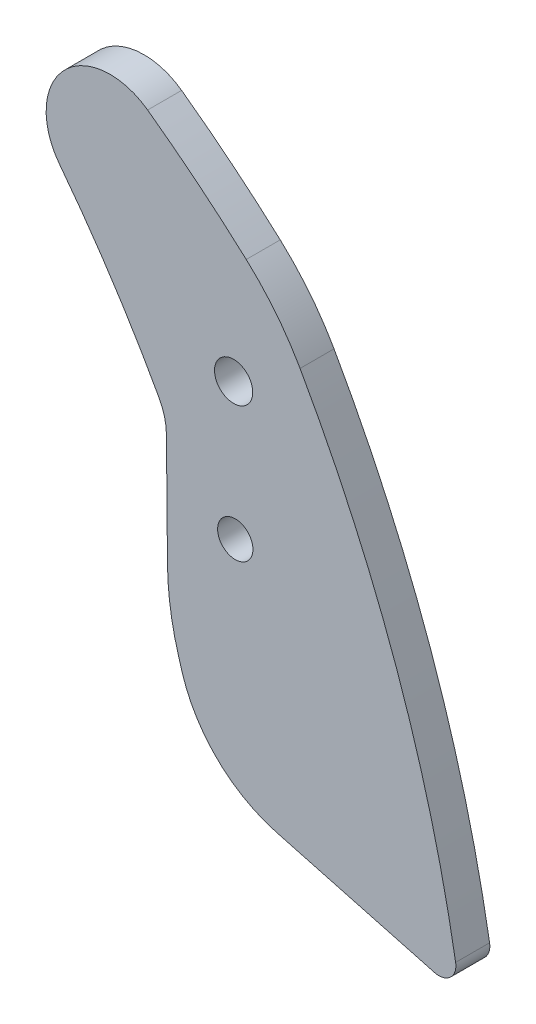
ISO-10303-21;
HEADER;
FILE_DESCRIPTION(('STEP AP214'),'2;1');
FILE_NAME('part.step','',(''),(''),'','','');
FILE_SCHEMA(('AUTOMOTIVE_DESIGN { 1 0 10303 214 1 1 1 1 }'));
ENDSEC;
DATA;
#1=APPLICATION_CONTEXT('core data for automotive mechanical design processes');
#2=APPLICATION_PROTOCOL_DEFINITION('international standard','automotive_design',2000,#1);
#3=PRODUCT_CONTEXT('',#1,'mechanical');
#4=PRODUCT('Part','Part','',(#3));
#5=PRODUCT_RELATED_PRODUCT_CATEGORY('part','',(#4));
#6=PRODUCT_DEFINITION_FORMATION('','',#4);
#7=PRODUCT_DEFINITION_CONTEXT('part definition',#1,'design');
#8=PRODUCT_DEFINITION('design','',#6,#7);
#9=PRODUCT_DEFINITION_SHAPE('','',#8);
#10=(LENGTH_UNIT() NAMED_UNIT(*) SI_UNIT(.MILLI.,.METRE.));
#11=(NAMED_UNIT(*) PLANE_ANGLE_UNIT() SI_UNIT($,.RADIAN.));
#12=(NAMED_UNIT(*) SI_UNIT($,.STERADIAN.) SOLID_ANGLE_UNIT());
#13=UNCERTAINTY_MEASURE_WITH_UNIT(LENGTH_MEASURE(1.E-05),#10,'distance_accuracy_value','');
#14=(GEOMETRIC_REPRESENTATION_CONTEXT(3) GLOBAL_UNCERTAINTY_ASSIGNED_CONTEXT((#13)) GLOBAL_UNIT_ASSIGNED_CONTEXT((#10,
#11,#12)) REPRESENTATION_CONTEXT('',''));
#15=CARTESIAN_POINT('',(0.,0.,0.));
#16=DIRECTION('',(0.,0.,1.));
#17=DIRECTION('',(1.,0.,0.));
#18=AXIS2_PLACEMENT_3D('',#15,#16,#17);
#19=CARTESIAN_POINT('',(-113.879070235342,148.704037871427,6.35));
#20=DIRECTION('',(0.,0.,-1.));
#21=DIRECTION('',(-1.,0.,0.));
#22=AXIS2_PLACEMENT_3D('',#19,#20,#21);
#23=CYLINDRICAL_SURFACE('',#22,11.9633626690362);
#24=CARTESIAN_POINT('',(-113.879070235342,148.704037871427,0.));
#25=DIRECTION('',(0.,0.,1.));
#26=DIRECTION('',(1.,0.,0.));
#27=AXIS2_PLACEMENT_3D('',#24,#25,#26);
#28=CIRCLE('',#27,11.9633626690362);
#29=CARTESIAN_POINT('',(-123.364773653101,141.414080599866,0.));
#30=VERTEX_POINT('',#29);
#31=CARTESIAN_POINT('',(-106.865340620496,158.395768534252,0.));
#32=VERTEX_POINT('',#31);
#33=EDGE_CURVE('E143',#30,#32,#28,.F.);
#34=ORIENTED_EDGE('',*,*,#33,.F.);
#35=DIRECTION('',(0.,0.,-1.));
#36=VECTOR('',#35,1.);
#37=CARTESIAN_POINT('',(-123.364773653101,141.414080599866,6.35));
#38=LINE('',#37,#36);
#39=CARTESIAN_POINT('',(-123.364773653101,141.414080599866,6.35));
#40=VERTEX_POINT('',#39);
#41=EDGE_CURVE('E131',#40,#30,#38,.T.);
#42=ORIENTED_EDGE('',*,*,#41,.F.);
#43=CARTESIAN_POINT('',(-113.879070235342,148.704037871427,6.35));
#44=DIRECTION('',(0.,0.,1.));
#45=DIRECTION('',(1.,0.,0.));
#46=AXIS2_PLACEMENT_3D('',#43,#44,#45);
#47=CIRCLE('',#46,11.9633626690362);
#48=CARTESIAN_POINT('',(-106.865340620496,158.395768534252,6.35));
#49=VERTEX_POINT('',#48);
#50=EDGE_CURVE('E138',#40,#49,#47,.F.);
#51=ORIENTED_EDGE('',*,*,#50,.T.);
#52=DIRECTION('',(0.,0.,-1.));
#53=VECTOR('',#52,1.);
#54=CARTESIAN_POINT('',(-106.865340620496,158.395768534252,6.35));
#55=LINE('',#54,#53);
#56=EDGE_CURVE('E176',#49,#32,#55,.T.);
#57=ORIENTED_EDGE('',*,*,#56,.T.);
#58=EDGE_LOOP('',(#34,#42,#51,#57));
#59=FACE_BOUND('',#58,.T.);
#60=ADVANCED_FACE('F36',(#59),#23,.T.);
#61=CARTESIAN_POINT('',(-299.585928433731,5.98451548285919,6.35));
#62=DIRECTION('',(0.,0.,-1.));
#63=DIRECTION('',(-1.,0.,0.));
#64=AXIS2_PLACEMENT_3D('',#61,#62,#63);
#65=CYLINDRICAL_SURFACE('',#64,222.25);
#66=CARTESIAN_POINT('',(-299.585928433731,5.98451548285919,0.));
#67=DIRECTION('',(0.,0.,1.));
#68=DIRECTION('',(1.,0.,0.));
#69=AXIS2_PLACEMENT_3D('',#66,#67,#68);
#70=CIRCLE('',#69,222.25);
#71=CARTESIAN_POINT('',(-104.721441138378,112.862455634788,0.));
#72=VERTEX_POINT('',#71);
#73=EDGE_CURVE('E178',#72,#30,#70,.T.);
#74=ORIENTED_EDGE('',*,*,#73,.F.);
#75=DIRECTION('',(0.,0.,-1.));
#76=VECTOR('',#75,1.);
#77=CARTESIAN_POINT('',(-104.721441138378,112.862455634788,6.35));
#78=LINE('',#77,#76);
#79=CARTESIAN_POINT('',(-104.721441138378,112.862455634788,6.35));
#80=VERTEX_POINT('',#79);
#81=EDGE_CURVE('E134',#72,#80,#78,.F.);
#82=ORIENTED_EDGE('',*,*,#81,.T.);
#83=CARTESIAN_POINT('',(-299.585928433731,5.98451548285919,6.35));
#84=DIRECTION('',(0.,0.,1.));
#85=DIRECTION('',(1.,0.,0.));
#86=AXIS2_PLACEMENT_3D('',#83,#84,#85);
#87=CIRCLE('',#86,222.25);
#88=EDGE_CURVE('E127',#80,#40,#87,.T.);
#89=ORIENTED_EDGE('',*,*,#88,.T.);
#90=ORIENTED_EDGE('',*,*,#41,.T.);
#91=EDGE_LOOP('',(#74,#82,#89,#90));
#92=FACE_BOUND('',#91,.T.);
#93=ADVANCED_FACE('F130',(#92),#65,.F.);
#94=CARTESIAN_POINT('',(-102.331128611491,-0.962687486218128,6.35));
#95=DIRECTION('',(0.999955751729183,0.00940715598492309,0.));
#96=DIRECTION('',(-0.00940715598492309,0.999955751729183,0.));
#97=AXIS2_PLACEMENT_3D('',#94,#95,#96);
#98=PLANE('',#97);
#99=DIRECTION('',(0.00940715598492309,-0.999955751729183,0.));
#100=VECTOR('',#99,1.);
#101=CARTESIAN_POINT('',(-102.331128611491,-0.962687486218128,6.35));
#102=LINE('',#101,#100);
#103=CARTESIAN_POINT('',(-103.352657212055,107.623095648074,6.35));
#104=VERTEX_POINT('',#103);
#105=CARTESIAN_POINT('',(-103.15638986928,86.7603972301212,6.35));
#106=VERTEX_POINT('',#105);
#107=EDGE_CURVE('E137',#104,#106,#102,.T.);
#108=ORIENTED_EDGE('',*,*,#107,.F.);
#109=DIRECTION('',(0.,0.,-1.));
#110=VECTOR('',#109,1.);
#111=CARTESIAN_POINT('',(-103.352657212055,107.623095648074,6.35));
#112=LINE('',#111,#110);
#113=CARTESIAN_POINT('',(-103.352657212055,107.623095648074,0.));
#114=VERTEX_POINT('',#113);
#115=EDGE_CURVE('E144',#104,#114,#112,.T.);
#116=ORIENTED_EDGE('',*,*,#115,.T.);
#117=DIRECTION('',(0.00940715598492309,-0.999955751729183,0.));
#118=VECTOR('',#117,1.);
#119=CARTESIAN_POINT('',(-102.331128611491,-0.962687486218128,0.));
#120=LINE('',#119,#118);
#121=CARTESIAN_POINT('',(-103.15638986928,86.7603972301212,0.));
#122=VERTEX_POINT('',#121);
#123=EDGE_CURVE('E180',#114,#122,#120,.T.);
#124=ORIENTED_EDGE('',*,*,#123,.T.);
#125=DIRECTION('',(0.,0.,-1.));
#126=VECTOR('',#125,1.);
#127=CARTESIAN_POINT('',(-103.15638986928,86.7603972301212,6.35));
#128=LINE('',#127,#126);
#129=EDGE_CURVE('E145',#106,#122,#128,.T.);
#130=ORIENTED_EDGE('',*,*,#129,.F.);
#131=EDGE_LOOP('',(#108,#116,#124,#130));
#132=FACE_BOUND('',#131,.T.);
#133=ADVANCED_FACE('F240',(#132),#98,.F.);
#134=CARTESIAN_POINT('',(-52.358637681438,87.2382807541552,6.35));
#135=DIRECTION('',(0.,0.,-1.));
#136=DIRECTION('',(-1.,0.,0.));
#137=AXIS2_PLACEMENT_3D('',#134,#135,#136);
#138=CYLINDRICAL_SURFACE('',#137,50.7999999999998);
#139=CARTESIAN_POINT('',(-52.358637681438,87.2382807541552,0.));
#140=DIRECTION('',(0.,0.,1.));
#141=DIRECTION('',(1.,0.,0.));
#142=AXIS2_PLACEMENT_3D('',#139,#140,#141);
#143=CIRCLE('',#142,50.7999999999998);
#144=CARTESIAN_POINT('',(-101.08553478829,72.8741066275903,0.));
#145=VERTEX_POINT('',#144);
#146=EDGE_CURVE('E182',#122,#145,#143,.T.);
#147=ORIENTED_EDGE('',*,*,#146,.T.);
#148=DIRECTION('',(0.,0.,-1.));
#149=VECTOR('',#148,1.);
#150=CARTESIAN_POINT('',(-101.08553478829,72.8741066275903,6.35));
#151=LINE('',#150,#149);
#152=CARTESIAN_POINT('',(-101.08553478829,72.8741066275903,6.35));
#153=VERTEX_POINT('',#152);
#154=EDGE_CURVE('E205',#153,#145,#151,.T.);
#155=ORIENTED_EDGE('',*,*,#154,.F.);
#156=CARTESIAN_POINT('',(-52.358637681438,87.2382807541552,6.35));
#157=DIRECTION('',(0.,0.,1.));
#158=DIRECTION('',(1.,0.,0.));
#159=AXIS2_PLACEMENT_3D('',#156,#157,#158);
#160=CIRCLE('',#159,50.7999999999998);
#161=EDGE_CURVE('E159',#106,#153,#160,.T.);
#162=ORIENTED_EDGE('',*,*,#161,.F.);
#163=ORIENTED_EDGE('',*,*,#129,.T.);
#164=EDGE_LOOP('',(#147,#155,#162,#163));
#165=FACE_BOUND('',#164,.T.);
#166=ADVANCED_FACE('F244',(#165),#138,.T.);
#167=CARTESIAN_POINT('',(-73.2385311304858,-21.5899446998464,6.35));
#168=DIRECTION('',(0.959190887930161,0.28275933320007,0.));
#169=DIRECTION('',(-0.28275933320007,0.959190887930162,0.));
#170=AXIS2_PLACEMENT_3D('',#167,#168,#169);
#171=PLANE('',#170);
#172=DIRECTION('',(0.28275933320007,-0.959190887930161,0.));
#173=VECTOR('',#172,1.);
#174=CARTESIAN_POINT('',(-73.2385311304858,-21.5899446998464,0.));
#175=LINE('',#174,#173);
#176=CARTESIAN_POINT('',(-100.480479070447,70.8216052134851,0.));
#177=VERTEX_POINT('',#176);
#178=EDGE_CURVE('E184',#145,#177,#175,.T.);
#179=ORIENTED_EDGE('',*,*,#178,.T.);
#180=DIRECTION('',(0.,0.,-1.));
#181=VECTOR('',#180,1.);
#182=CARTESIAN_POINT('',(-100.480479070447,70.8216052134851,6.35));
#183=LINE('',#182,#181);
#184=CARTESIAN_POINT('',(-100.480479070447,70.8216052134851,6.35));
#185=VERTEX_POINT('',#184);
#186=EDGE_CURVE('E59',#177,#185,#183,.F.);
#187=ORIENTED_EDGE('',*,*,#186,.T.);
#188=DIRECTION('',(0.28275933320007,-0.959190887930161,0.));
#189=VECTOR('',#188,1.);
#190=CARTESIAN_POINT('',(-73.2385311304858,-21.5899446998464,6.35));
#191=LINE('',#190,#189);
#192=EDGE_CURVE('E161',#153,#185,#191,.T.);
#193=ORIENTED_EDGE('',*,*,#192,.F.);
#194=ORIENTED_EDGE('',*,*,#154,.T.);
#195=EDGE_LOOP('',(#179,#187,#193,#194));
#196=FACE_BOUND('',#195,.T.);
#197=ADVANCED_FACE('F343',(#196),#171,.F.);
#198=CARTESIAN_POINT('',(7.82804510926493,29.2146620717186,6.35));
#199=DIRECTION('',(0.258819045102514,0.96592582628907,0.));
#200=DIRECTION('',(-0.96592582628907,0.258819045102514,0.));
#201=AXIS2_PLACEMENT_3D('',#198,#199,#200);
#202=PLANE('',#201);
#203=DIRECTION('',(0.96592582628907,-0.258819045102514,0.));
#204=VECTOR('',#203,1.);
#205=CARTESIAN_POINT('',(7.82804510926493,29.2146620717186,6.35));
#206=LINE('',#205,#204);
#207=CARTESIAN_POINT('',(-82.6910342626248,53.4691762890245,6.35));
#208=VERTEX_POINT('',#207);
#209=CARTESIAN_POINT('',(-53.236955372904,45.5769796367214,6.35));
#210=VERTEX_POINT('',#209);
#211=EDGE_CURVE('E163',#208,#210,#206,.T.);
#212=ORIENTED_EDGE('',*,*,#211,.F.);
#213=DIRECTION('',(0.,0.,-1.));
#214=VECTOR('',#213,1.);
#215=CARTESIAN_POINT('',(-82.6910342626248,53.4691762890245,6.35));
#216=LINE('',#215,#214);
#217=CARTESIAN_POINT('',(-82.6910342626248,53.4691762890245,0.));
#218=VERTEX_POINT('',#217);
#219=EDGE_CURVE('E215',#208,#218,#216,.T.);
#220=ORIENTED_EDGE('',*,*,#219,.T.);
#221=DIRECTION('',(0.96592582628907,-0.258819045102514,0.));
#222=VECTOR('',#221,1.);
#223=CARTESIAN_POINT('',(7.82804510926493,29.2146620717186,0.));
#224=LINE('',#223,#222);
#225=CARTESIAN_POINT('',(-53.236955372904,45.5769796367214,0.));
#226=VERTEX_POINT('',#225);
#227=EDGE_CURVE('E186',#218,#226,#224,.T.);
#228=ORIENTED_EDGE('',*,*,#227,.T.);
#229=DIRECTION('',(0.,0.,-1.));
#230=VECTOR('',#229,1.);
#231=CARTESIAN_POINT('',(-53.236955372904,45.5769796367214,6.35));
#232=LINE('',#231,#230);
#233=EDGE_CURVE('E213',#226,#210,#232,.F.);
#234=ORIENTED_EDGE('',*,*,#233,.T.);
#235=EDGE_LOOP('',(#212,#220,#228,#234));
#236=FACE_BOUND('',#235,.T.);
#237=ADVANCED_FACE('F251',(#236),#202,.F.);
#238=CARTESIAN_POINT('',(-299.585928433731,5.98451548285919,6.35));
#239=DIRECTION('',(0.,0.,-1.));
#240=DIRECTION('',(-1.,0.,0.));
#241=AXIS2_PLACEMENT_3D('',#238,#239,#240);
#242=CYLINDRICAL_SURFACE('',#241,254.);
#243=CARTESIAN_POINT('',(-299.585928433731,5.98451548285919,6.35));
#244=DIRECTION('',(0.,0.,1.));
#245=DIRECTION('',(1.,0.,0.));
#246=AXIS2_PLACEMENT_3D('',#243,#244,#245);
#247=CIRCLE('',#246,254.);
#248=CARTESIAN_POINT('',(-49.2864615688931,49.1837850042061,6.35));
#249=VERTEX_POINT('',#248);
#250=CARTESIAN_POINT('',(-78.3700385424587,130.802503207436,6.35));
#251=VERTEX_POINT('',#250);
#252=EDGE_CURVE('E165',#249,#251,#247,.T.);
#253=ORIENTED_EDGE('',*,*,#252,.F.);
#254=DIRECTION('',(0.,0.,-1.));
#255=VECTOR('',#254,1.);
#256=CARTESIAN_POINT('',(-49.2864615688931,49.1837850042061,6.35));
#257=LINE('',#256,#255);
#258=CARTESIAN_POINT('',(-49.2864615688931,49.1837850042061,0.));
#259=VERTEX_POINT('',#258);
#260=EDGE_CURVE('E226',#249,#259,#257,.T.);
#261=ORIENTED_EDGE('',*,*,#260,.T.);
#262=CARTESIAN_POINT('',(-299.585928433731,5.98451548285919,0.));
#263=DIRECTION('',(0.,0.,1.));
#264=DIRECTION('',(1.,0.,0.));
#265=AXIS2_PLACEMENT_3D('',#262,#263,#264);
#266=CIRCLE('',#265,254.);
#267=CARTESIAN_POINT('',(-78.3700385424587,130.802503207436,0.));
#268=VERTEX_POINT('',#267);
#269=EDGE_CURVE('E189',#259,#268,#266,.T.);
#270=ORIENTED_EDGE('',*,*,#269,.T.);
#271=DIRECTION('',(0.,0.,-1.));
#272=VECTOR('',#271,1.);
#273=CARTESIAN_POINT('',(-78.3700385424587,130.802503207436,6.35));
#274=LINE('',#273,#272);
#275=EDGE_CURVE('E202',#251,#268,#274,.T.);
#276=ORIENTED_EDGE('',*,*,#275,.F.);
#277=EDGE_LOOP('',(#253,#261,#270,#276));
#278=FACE_BOUND('',#277,.T.);
#279=ADVANCED_FACE('F259',(#278),#242,.T.);
#280=CARTESIAN_POINT('',(-122.613216520713,105.83890566252,6.35));
#281=DIRECTION('',(0.,0.,-1.));
#282=DIRECTION('',(-1.,0.,0.));
#283=AXIS2_PLACEMENT_3D('',#280,#281,#282);
#284=CYLINDRICAL_SURFACE('',#283,50.8);
#285=CARTESIAN_POINT('',(-122.613216520713,105.83890566252,0.));
#286=DIRECTION('',(0.,0.,1.));
#287=DIRECTION('',(1.,0.,0.));
#288=AXIS2_PLACEMENT_3D('',#285,#286,#287);
#289=CIRCLE('',#288,50.8);
#290=CARTESIAN_POINT('',(-88.4278492038008,143.415502919427,0.));
#291=VERTEX_POINT('',#290);
#292=EDGE_CURVE('E191',#268,#291,#289,.T.);
#293=ORIENTED_EDGE('',*,*,#292,.T.);
#294=DIRECTION('',(0.,0.,-1.));
#295=VECTOR('',#294,1.);
#296=CARTESIAN_POINT('',(-88.4278492038008,143.415502919427,6.35));
#297=LINE('',#296,#295);
#298=CARTESIAN_POINT('',(-88.4278492038008,143.415502919427,6.35));
#299=VERTEX_POINT('',#298);
#300=EDGE_CURVE('E199',#299,#291,#297,.T.);
#301=ORIENTED_EDGE('',*,*,#300,.F.);
#302=CARTESIAN_POINT('',(-122.613216520713,105.83890566252,6.35));
#303=DIRECTION('',(0.,0.,1.));
#304=DIRECTION('',(1.,0.,0.));
#305=AXIS2_PLACEMENT_3D('',#302,#303,#304);
#306=CIRCLE('',#305,50.8);
#307=EDGE_CURVE('E167',#251,#299,#306,.T.);
#308=ORIENTED_EDGE('',*,*,#307,.F.);
#309=ORIENTED_EDGE('',*,*,#275,.T.);
#310=EDGE_LOOP('',(#293,#301,#308,#309));
#311=FACE_BOUND('',#310,.T.);
#312=ADVANCED_FACE('F264',(#311),#284,.T.);
#313=CARTESIAN_POINT('',(-90.792034131268,122.498229566222,6.35));
#314=DIRECTION('',(0.,0.,-1.));
#315=DIRECTION('',(-1.,0.,0.));
#316=AXIS2_PLACEMENT_3D('',#313,#314,#315);
#317=CYLINDRICAL_SURFACE('',#316,3.57187500000001);
#318=CARTESIAN_POINT('',(-90.792034131268,122.498229566222,6.35));
#319=DIRECTION('',(0.,0.,1.));
#320=DIRECTION('',(1.,0.,0.));
#321=AXIS2_PLACEMENT_3D('',#318,#319,#320);
#322=CIRCLE('',#321,3.57187500000001);
#323=CARTESIAN_POINT('',(-87.220159131268,122.498229566222,6.35));
#324=VERTEX_POINT('',#323);
#325=EDGE_CURVE('E170',#324,#324,#322,.T.);
#326=ORIENTED_EDGE('',*,*,#325,.T.);
#327=EDGE_LOOP('',(#326));
#328=FACE_BOUND('',#327,.T.);
#329=CARTESIAN_POINT('',(-90.792034131268,122.498229566222,0.));
#330=DIRECTION('',(0.,0.,1.));
#331=DIRECTION('',(1.,0.,0.));
#332=AXIS2_PLACEMENT_3D('',#329,#330,#331);
#333=CIRCLE('',#332,3.57187500000001);
#334=CARTESIAN_POINT('',(-87.220159131268,122.498229566222,0.));
#335=VERTEX_POINT('',#334);
#336=EDGE_CURVE('E155',#335,#335,#333,.T.);
#337=ORIENTED_EDGE('',*,*,#336,.F.);
#338=EDGE_LOOP('',(#337));
#339=FACE_BOUND('',#338,.T.);
#340=ADVANCED_FACE('F270',(#328,#339),#317,.F.);
#341=CARTESIAN_POINT('',(-231.579074843371,-13.9364980938701,6.35));
#342=DIRECTION('',(0.,0.,-1.));
#343=DIRECTION('',(-1.,0.,0.));
#344=AXIS2_PLACEMENT_3D('',#341,#342,#343);
#345=CYLINDRICAL_SURFACE('',#344,212.725);
#346=CARTESIAN_POINT('',(-231.579074843371,-13.9364980938701,0.));
#347=DIRECTION('',(0.,0.,1.));
#348=DIRECTION('',(1.,0.,0.));
#349=AXIS2_PLACEMENT_3D('',#346,#347,#348);
#350=CIRCLE('',#349,212.725);
#351=EDGE_CURVE('E193',#291,#32,#350,.T.);
#352=ORIENTED_EDGE('',*,*,#351,.T.);
#353=ORIENTED_EDGE('',*,*,#56,.F.);
#354=CARTESIAN_POINT('',(-231.579074843371,-13.9364980938701,6.35));
#355=DIRECTION('',(0.,0.,1.));
#356=DIRECTION('',(1.,0.,0.));
#357=AXIS2_PLACEMENT_3D('',#354,#355,#356);
#358=CIRCLE('',#357,212.725);
#359=EDGE_CURVE('E150',#299,#49,#358,.T.);
#360=ORIENTED_EDGE('',*,*,#359,.F.);
#361=ORIENTED_EDGE('',*,*,#300,.T.);
#362=EDGE_LOOP('',(#352,#353,#360,#361));
#363=FACE_BOUND('',#362,.T.);
#364=ADVANCED_FACE('F267',(#363),#345,.T.);
#365=CARTESIAN_POINT('',(-90.4829115348646,97.1001106748474,6.35));
#366=DIRECTION('',(0.,0.,-1.));
#367=DIRECTION('',(-1.,0.,0.));
#368=AXIS2_PLACEMENT_3D('',#365,#366,#367);
#369=CYLINDRICAL_SURFACE('',#368,3.302);
#370=CARTESIAN_POINT('',(-90.4829115348646,97.1001106748474,6.35));
#371=DIRECTION('',(0.,0.,1.));
#372=DIRECTION('',(1.,0.,0.));
#373=AXIS2_PLACEMENT_3D('',#370,#371,#372);
#374=CIRCLE('',#373,3.302);
#375=CARTESIAN_POINT('',(-87.1809115348646,97.1001106748474,6.35));
#376=VERTEX_POINT('',#375);
#377=EDGE_CURVE('E173',#376,#376,#374,.T.);
#378=ORIENTED_EDGE('',*,*,#377,.T.);
#379=EDGE_LOOP('',(#378));
#380=FACE_BOUND('',#379,.T.);
#381=CARTESIAN_POINT('',(-90.4829115348646,97.1001106748474,0.));
#382=DIRECTION('',(0.,0.,1.));
#383=DIRECTION('',(1.,0.,0.));
#384=AXIS2_PLACEMENT_3D('',#381,#382,#383);
#385=CIRCLE('',#384,3.302);
#386=CARTESIAN_POINT('',(-87.1809115348646,97.1001106748474,0.));
#387=VERTEX_POINT('',#386);
#388=EDGE_CURVE('E152',#387,#387,#385,.T.);
#389=ORIENTED_EDGE('',*,*,#388,.F.);
#390=EDGE_LOOP('',(#389));
#391=FACE_BOUND('',#390,.T.);
#392=ADVANCED_FACE('F269',(#380,#391),#369,.F.);
#393=CARTESIAN_POINT('',(0.,0.,6.35));
#394=DIRECTION('',(0.,0.,1.));
#395=DIRECTION('',(1.,0.,0.));
#396=AXIS2_PLACEMENT_3D('',#393,#394,#395);
#397=PLANE('',#396);
#398=ORIENTED_EDGE('',*,*,#192,.T.);
#399=CARTESIAN_POINT('',(-76.117030517021,78.0036922767669,6.35));
#400=DIRECTION('',(0.,0.,1.));
#401=DIRECTION('',(1.,0.,0.));
#402=AXIS2_PLACEMENT_3D('',#399,#400,#401);
#403=CIRCLE('',#402,25.4);
#404=EDGE_CURVE('E224',#185,#208,#403,.T.);
#405=ORIENTED_EDGE('',*,*,#404,.T.);
#406=ORIENTED_EDGE('',*,*,#211,.T.);
#407=CARTESIAN_POINT('',(-52.4152049047036,48.6437941351892,6.35));
#408=DIRECTION('',(0.,0.,1.));
#409=DIRECTION('',(1.,0.,0.));
#410=AXIS2_PLACEMENT_3D('',#407,#408,#409);
#411=CIRCLE('',#410,3.175);
#412=EDGE_CURVE('E51',#210,#249,#411,.T.);
#413=ORIENTED_EDGE('',*,*,#412,.T.);
#414=ORIENTED_EDGE('',*,*,#252,.T.);
#415=ORIENTED_EDGE('',*,*,#307,.T.);
#416=ORIENTED_EDGE('',*,*,#359,.T.);
#417=ORIENTED_EDGE('',*,*,#50,.F.);
#418=ORIENTED_EDGE('',*,*,#88,.F.);
#419=CARTESIAN_POINT('',(-114.464665503146,107.518558627191,6.35));
#420=DIRECTION('',(0.,0.,1.));
#421=DIRECTION('',(1.,0.,0.));
#422=AXIS2_PLACEMENT_3D('',#419,#420,#421);
#423=CIRCLE('',#422,11.1125);
#424=EDGE_CURVE('E12',#80,#104,#423,.F.);
#425=ORIENTED_EDGE('',*,*,#424,.T.);
#426=ORIENTED_EDGE('',*,*,#107,.T.);
#427=ORIENTED_EDGE('',*,*,#161,.T.);
#428=EDGE_LOOP('',(#398,#405,#406,#413,#414,#415,#416,#417,#418,#425,#426,#427));
#429=FACE_BOUND('',#428,.T.);
#430=ORIENTED_EDGE('',*,*,#325,.F.);
#431=EDGE_LOOP('',(#430));
#432=FACE_BOUND('',#431,.T.);
#433=ORIENTED_EDGE('',*,*,#377,.F.);
#434=EDGE_LOOP('',(#433));
#435=FACE_BOUND('',#434,.T.);
#436=ADVANCED_FACE('F147',(#429,#432,#435),#397,.T.);
#437=CARTESIAN_POINT('',(0.,0.,0.));
#438=DIRECTION('',(0.,0.,1.));
#439=DIRECTION('',(1.,0.,0.));
#440=AXIS2_PLACEMENT_3D('',#437,#438,#439);
#441=PLANE('',#440);
#442=ORIENTED_EDGE('',*,*,#227,.F.);
#443=CARTESIAN_POINT('',(-76.117030517021,78.0036922767669,0.));
#444=DIRECTION('',(0.,0.,1.));
#445=DIRECTION('',(1.,0.,0.));
#446=AXIS2_PLACEMENT_3D('',#443,#444,#445);
#447=CIRCLE('',#446,25.4);
#448=EDGE_CURVE('E220',#218,#177,#447,.F.);
#449=ORIENTED_EDGE('',*,*,#448,.T.);
#450=ORIENTED_EDGE('',*,*,#178,.F.);
#451=ORIENTED_EDGE('',*,*,#146,.F.);
#452=ORIENTED_EDGE('',*,*,#123,.F.);
#453=CARTESIAN_POINT('',(-114.464665503146,107.518558627191,0.));
#454=DIRECTION('',(0.,0.,1.));
#455=DIRECTION('',(1.,0.,0.));
#456=AXIS2_PLACEMENT_3D('',#453,#454,#455);
#457=CIRCLE('',#456,11.1125);
#458=EDGE_CURVE('E44',#114,#72,#457,.T.);
#459=ORIENTED_EDGE('',*,*,#458,.T.);
#460=ORIENTED_EDGE('',*,*,#73,.T.);
#461=ORIENTED_EDGE('',*,*,#33,.T.);
#462=ORIENTED_EDGE('',*,*,#351,.F.);
#463=ORIENTED_EDGE('',*,*,#292,.F.);
#464=ORIENTED_EDGE('',*,*,#269,.F.);
#465=CARTESIAN_POINT('',(-52.4152049047036,48.6437941351892,0.));
#466=DIRECTION('',(0.,0.,1.));
#467=DIRECTION('',(1.,0.,0.));
#468=AXIS2_PLACEMENT_3D('',#465,#466,#467);
#469=CIRCLE('',#468,3.175);
#470=EDGE_CURVE('E218',#259,#226,#469,.F.);
#471=ORIENTED_EDGE('',*,*,#470,.T.);
#472=EDGE_LOOP('',(#442,#449,#450,#451,#452,#459,#460,#461,#462,#463,#464,#471));
#473=FACE_BOUND('',#472,.T.);
#474=ORIENTED_EDGE('',*,*,#336,.T.);
#475=EDGE_LOOP('',(#474));
#476=FACE_BOUND('',#475,.T.);
#477=ORIENTED_EDGE('',*,*,#388,.T.);
#478=EDGE_LOOP('',(#477));
#479=FACE_BOUND('',#478,.T.);
#480=ADVANCED_FACE('F231',(#473,#476,#479),#441,.F.);
#481=CARTESIAN_POINT('',(-114.464665503146,107.518558627191,6.35));
#482=DIRECTION('',(0.,0.,-1.));
#483=DIRECTION('',(-1.,0.,0.));
#484=AXIS2_PLACEMENT_3D('',#481,#482,#483);
#485=CYLINDRICAL_SURFACE('',#484,11.1125);
#486=ORIENTED_EDGE('',*,*,#424,.F.);
#487=ORIENTED_EDGE('',*,*,#81,.F.);
#488=ORIENTED_EDGE('',*,*,#458,.F.);
#489=ORIENTED_EDGE('',*,*,#115,.F.);
#490=EDGE_LOOP('',(#486,#487,#488,#489));
#491=FACE_BOUND('',#490,.T.);
#492=ADVANCED_FACE('F236',(#491),#485,.F.);
#493=CARTESIAN_POINT('',(-76.117030517021,78.0036922767669,6.35));
#494=DIRECTION('',(0.,0.,-1.));
#495=DIRECTION('',(-1.,0.,0.));
#496=AXIS2_PLACEMENT_3D('',#493,#494,#495);
#497=CYLINDRICAL_SURFACE('',#496,25.4);
#498=ORIENTED_EDGE('',*,*,#404,.F.);
#499=ORIENTED_EDGE('',*,*,#186,.F.);
#500=ORIENTED_EDGE('',*,*,#448,.F.);
#501=ORIENTED_EDGE('',*,*,#219,.F.);
#502=EDGE_LOOP('',(#498,#499,#500,#501));
#503=FACE_BOUND('',#502,.T.);
#504=ADVANCED_FACE('F249',(#503),#497,.T.);
#505=CARTESIAN_POINT('',(-52.4152049047036,48.6437941351892,6.35));
#506=DIRECTION('',(0.,0.,-1.));
#507=DIRECTION('',(-1.,0.,0.));
#508=AXIS2_PLACEMENT_3D('',#505,#506,#507);
#509=CYLINDRICAL_SURFACE('',#508,3.175);
#510=ORIENTED_EDGE('',*,*,#412,.F.);
#511=ORIENTED_EDGE('',*,*,#233,.F.);
#512=ORIENTED_EDGE('',*,*,#470,.F.);
#513=ORIENTED_EDGE('',*,*,#260,.F.);
#514=EDGE_LOOP('',(#510,#511,#512,#513));
#515=FACE_BOUND('',#514,.T.);
#516=ADVANCED_FACE('F38',(#515),#509,.T.);
#517=CLOSED_SHELL('',(#60,#93,#133,#166,#197,#237,#279,#312,#340,#364,#392,#436,#480,#492,#504,#516));
#518=MANIFOLD_SOLID_BREP('B2',#517);
#519=ADVANCED_BREP_SHAPE_REPRESENTATION('',(#18,#518),#14);
#520=SHAPE_DEFINITION_REPRESENTATION(#9,#519);
ENDSEC;
END-ISO-10303-21;
